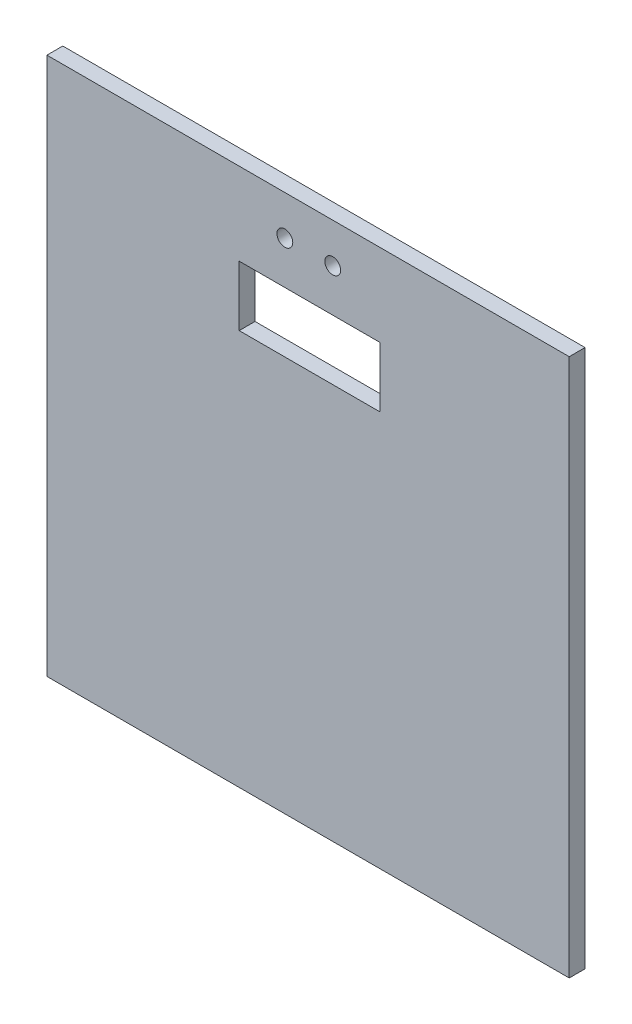
ISO-10303-21;
HEADER;
FILE_DESCRIPTION(('STEP AP214'),'2;1');
FILE_NAME('part.step','',(''),(''),'','','');
FILE_SCHEMA(('AUTOMOTIVE_DESIGN { 1 0 10303 214 1 1 1 1 }'));
ENDSEC;
DATA;
#1=APPLICATION_CONTEXT('core data for automotive mechanical design processes');
#2=APPLICATION_PROTOCOL_DEFINITION('international standard','automotive_design',2000,#1);
#3=PRODUCT_CONTEXT('',#1,'mechanical');
#4=PRODUCT('Part','Part','',(#3));
#5=PRODUCT_RELATED_PRODUCT_CATEGORY('part','',(#4));
#6=PRODUCT_DEFINITION_FORMATION('','',#4);
#7=PRODUCT_DEFINITION_CONTEXT('part definition',#1,'design');
#8=PRODUCT_DEFINITION('design','',#6,#7);
#9=PRODUCT_DEFINITION_SHAPE('','',#8);
#10=(LENGTH_UNIT() NAMED_UNIT(*) SI_UNIT(.MILLI.,.METRE.));
#11=(NAMED_UNIT(*) PLANE_ANGLE_UNIT() SI_UNIT($,.RADIAN.));
#12=(NAMED_UNIT(*) SI_UNIT($,.STERADIAN.) SOLID_ANGLE_UNIT());
#13=UNCERTAINTY_MEASURE_WITH_UNIT(LENGTH_MEASURE(1.E-05),#10,'distance_accuracy_value','');
#14=(GEOMETRIC_REPRESENTATION_CONTEXT(3) GLOBAL_UNCERTAINTY_ASSIGNED_CONTEXT((#13)) GLOBAL_UNIT_ASSIGNED_CONTEXT((#10,
#11,#12)) REPRESENTATION_CONTEXT('',''));
#15=CARTESIAN_POINT('',(0.,0.,0.));
#16=DIRECTION('',(0.,0.,1.));
#17=DIRECTION('',(1.,0.,0.));
#18=AXIS2_PLACEMENT_3D('',#15,#16,#17);
#19=CARTESIAN_POINT('',(0.,0.,32.));
#20=DIRECTION('',(0.,0.,1.));
#21=DIRECTION('',(1.,0.,0.));
#22=AXIS2_PLACEMENT_3D('',#19,#20,#21);
#23=PLANE('',#22);
#24=CARTESIAN_POINT('',(249.003592831073,330.031505481251,32.));
#25=DIRECTION('',(0.,0.,1.));
#26=DIRECTION('',(1.,0.,0.));
#27=AXIS2_PLACEMENT_3D('',#24,#25,#26);
#28=CIRCLE('',#27,0.999999999999998);
#29=CARTESIAN_POINT('',(250.003592831073,330.031505481251,32.));
#30=VERTEX_POINT('',#29);
#31=EDGE_CURVE('E161',#30,#30,#28,.T.);
#32=ORIENTED_EDGE('',*,*,#31,.F.);
#33=EDGE_LOOP('',(#32));
#34=FACE_BOUND('',#33,.T.);
#35=DIRECTION('',(0.,-1.,0.));
#36=VECTOR('',#35,1.);
#37=CARTESIAN_POINT('',(218.940861289367,335.024014524093,32.));
#38=LINE('',#37,#36);
#39=CARTESIAN_POINT('',(218.940861289367,335.024014524093,32.));
#40=VERTEX_POINT('',#39);
#41=CARTESIAN_POINT('',(218.940861289367,267.024014524093,32.));
#42=VERTEX_POINT('',#41);
#43=EDGE_CURVE('E169',#40,#42,#38,.T.);
#44=ORIENTED_EDGE('',*,*,#43,.T.);
#45=DIRECTION('',(1.,0.,0.));
#46=VECTOR('',#45,1.);
#47=CARTESIAN_POINT('',(218.940861289367,267.024014524093,32.));
#48=LINE('',#47,#46);
#49=CARTESIAN_POINT('',(284.940861289367,267.024014524093,32.));
#50=VERTEX_POINT('',#49);
#51=EDGE_CURVE('E173',#42,#50,#48,.T.);
#52=ORIENTED_EDGE('',*,*,#51,.T.);
#53=DIRECTION('',(0.,1.,0.));
#54=VECTOR('',#53,1.);
#55=CARTESIAN_POINT('',(284.940861289367,335.024014524093,32.));
#56=LINE('',#55,#54);
#57=CARTESIAN_POINT('',(284.940861289367,335.024014524093,32.));
#58=VERTEX_POINT('',#57);
#59=EDGE_CURVE('E177',#50,#58,#56,.T.);
#60=ORIENTED_EDGE('',*,*,#59,.T.);
#61=DIRECTION('',(-1.,0.,0.));
#62=VECTOR('',#61,1.);
#63=CARTESIAN_POINT('',(218.940861289367,335.024014524093,32.));
#64=LINE('',#63,#62);
#65=EDGE_CURVE('E180',#58,#40,#64,.T.);
#66=ORIENTED_EDGE('',*,*,#65,.T.);
#67=EDGE_LOOP('',(#44,#52,#60,#66));
#68=FACE_BOUND('',#67,.T.);
#69=CARTESIAN_POINT('',(255.05528253112,330.031505481251,32.));
#70=DIRECTION('',(0.,0.,1.));
#71=DIRECTION('',(1.,0.,0.));
#72=AXIS2_PLACEMENT_3D('',#69,#70,#71);
#73=CIRCLE('',#72,0.999999999999998);
#74=CARTESIAN_POINT('',(256.05528253112,330.031505481251,32.));
#75=VERTEX_POINT('',#74);
#76=EDGE_CURVE('E153',#75,#75,#73,.T.);
#77=ORIENTED_EDGE('',*,*,#76,.F.);
#78=EDGE_LOOP('',(#77));
#79=FACE_BOUND('',#78,.T.);
#80=DIRECTION('',(1.,0.,0.));
#81=VECTOR('',#80,1.);
#82=CARTESIAN_POINT('',(243.235035756278,317.023888470709,32.));
#83=LINE('',#82,#81);
#84=CARTESIAN_POINT('',(243.235035756278,317.023888470709,32.));
#85=VERTEX_POINT('',#84);
#86=CARTESIAN_POINT('',(261.035035756278,317.023888470709,32.));
#87=VERTEX_POINT('',#86);
#88=EDGE_CURVE('E114',#85,#87,#83,.T.);
#89=ORIENTED_EDGE('',*,*,#88,.F.);
#90=DIRECTION('',(0.,-1.,0.));
#91=VECTOR('',#90,1.);
#92=CARTESIAN_POINT('',(243.235035756278,324.623888470709,32.));
#93=LINE('',#92,#91);
#94=CARTESIAN_POINT('',(243.235035756278,324.623888470709,32.));
#95=VERTEX_POINT('',#94);
#96=EDGE_CURVE('E105',#95,#85,#93,.T.);
#97=ORIENTED_EDGE('',*,*,#96,.F.);
#98=DIRECTION('',(-1.,0.,0.));
#99=VECTOR('',#98,1.);
#100=CARTESIAN_POINT('',(243.235035756278,324.623888470709,32.));
#101=LINE('',#100,#99);
#102=CARTESIAN_POINT('',(261.035035756278,324.623888470709,32.));
#103=VERTEX_POINT('',#102);
#104=EDGE_CURVE('E131',#103,#95,#101,.T.);
#105=ORIENTED_EDGE('',*,*,#104,.F.);
#106=DIRECTION('',(0.,1.,0.));
#107=VECTOR('',#106,1.);
#108=CARTESIAN_POINT('',(261.035035756278,324.623888470709,32.));
#109=LINE('',#108,#107);
#110=EDGE_CURVE('E127',#87,#103,#109,.T.);
#111=ORIENTED_EDGE('',*,*,#110,.F.);
#112=EDGE_LOOP('',(#89,#97,#105,#111));
#113=FACE_BOUND('',#112,.T.);
#114=ADVANCED_FACE('F39',(#34,#68,#79,#113),#23,.T.);
#115=CARTESIAN_POINT('',(0.,0.,30.));
#116=DIRECTION('',(0.,0.,1.));
#117=DIRECTION('',(1.,0.,0.));
#118=AXIS2_PLACEMENT_3D('',#115,#116,#117);
#119=PLANE('',#118);
#120=CARTESIAN_POINT('',(255.05528253112,330.031505481251,30.));
#121=DIRECTION('',(0.,0.,1.));
#122=DIRECTION('',(1.,0.,0.));
#123=AXIS2_PLACEMENT_3D('',#120,#121,#122);
#124=CIRCLE('',#123,0.999999999999998);
#125=CARTESIAN_POINT('',(256.05528253112,330.031505481251,30.));
#126=VERTEX_POINT('',#125);
#127=EDGE_CURVE('E123',#126,#126,#124,.T.);
#128=ORIENTED_EDGE('',*,*,#127,.T.);
#129=EDGE_LOOP('',(#128));
#130=FACE_BOUND('',#129,.T.);
#131=CARTESIAN_POINT('',(249.003592831073,330.031505481251,30.));
#132=DIRECTION('',(0.,0.,1.));
#133=DIRECTION('',(1.,0.,0.));
#134=AXIS2_PLACEMENT_3D('',#131,#132,#133);
#135=CIRCLE('',#134,0.999999999999998);
#136=CARTESIAN_POINT('',(250.003592831073,330.031505481251,30.));
#137=VERTEX_POINT('',#136);
#138=EDGE_CURVE('E157',#137,#137,#135,.T.);
#139=ORIENTED_EDGE('',*,*,#138,.T.);
#140=EDGE_LOOP('',(#139));
#141=FACE_BOUND('',#140,.T.);
#142=DIRECTION('',(0.,-1.,0.));
#143=VECTOR('',#142,1.);
#144=CARTESIAN_POINT('',(218.940861289367,335.024014524093,30.));
#145=LINE('',#144,#143);
#146=CARTESIAN_POINT('',(218.940861289367,335.024014524093,30.));
#147=VERTEX_POINT('',#146);
#148=CARTESIAN_POINT('',(218.940861289367,267.024014524093,30.));
#149=VERTEX_POINT('',#148);
#150=EDGE_CURVE('E165',#147,#149,#145,.T.);
#151=ORIENTED_EDGE('',*,*,#150,.F.);
#152=DIRECTION('',(-1.,0.,0.));
#153=VECTOR('',#152,1.);
#154=CARTESIAN_POINT('',(218.940861289367,335.024014524093,30.));
#155=LINE('',#154,#153);
#156=CARTESIAN_POINT('',(284.940861289367,335.024014524093,30.));
#157=VERTEX_POINT('',#156);
#158=EDGE_CURVE('E174',#157,#147,#155,.T.);
#159=ORIENTED_EDGE('',*,*,#158,.F.);
#160=DIRECTION('',(0.,1.,0.));
#161=VECTOR('',#160,1.);
#162=CARTESIAN_POINT('',(284.940861289367,335.024014524093,30.));
#163=LINE('',#162,#161);
#164=CARTESIAN_POINT('',(284.940861289367,267.024014524093,30.));
#165=VERTEX_POINT('',#164);
#166=EDGE_CURVE('E190',#165,#157,#163,.T.);
#167=ORIENTED_EDGE('',*,*,#166,.F.);
#168=DIRECTION('',(1.,0.,0.));
#169=VECTOR('',#168,1.);
#170=CARTESIAN_POINT('',(218.940861289367,267.024014524093,30.));
#171=LINE('',#170,#169);
#172=EDGE_CURVE('E187',#149,#165,#171,.T.);
#173=ORIENTED_EDGE('',*,*,#172,.F.);
#174=EDGE_LOOP('',(#151,#159,#167,#173));
#175=FACE_BOUND('',#174,.T.);
#176=DIRECTION('',(0.,-1.,0.));
#177=VECTOR('',#176,1.);
#178=CARTESIAN_POINT('',(243.235035756278,324.623888470709,30.));
#179=LINE('',#178,#177);
#180=CARTESIAN_POINT('',(243.235035756278,324.623888470709,30.));
#181=VERTEX_POINT('',#180);
#182=CARTESIAN_POINT('',(243.235035756278,317.023888470709,30.));
#183=VERTEX_POINT('',#182);
#184=EDGE_CURVE('E63',#181,#183,#179,.T.);
#185=ORIENTED_EDGE('',*,*,#184,.T.);
#186=DIRECTION('',(1.,0.,0.));
#187=VECTOR('',#186,1.);
#188=CARTESIAN_POINT('',(243.235035756278,317.023888470709,30.));
#189=LINE('',#188,#187);
#190=CARTESIAN_POINT('',(261.035035756278,317.023888470709,30.));
#191=VERTEX_POINT('',#190);
#192=EDGE_CURVE('E121',#183,#191,#189,.T.);
#193=ORIENTED_EDGE('',*,*,#192,.T.);
#194=DIRECTION('',(0.,1.,0.));
#195=VECTOR('',#194,1.);
#196=CARTESIAN_POINT('',(261.035035756278,324.623888470709,30.));
#197=LINE('',#196,#195);
#198=CARTESIAN_POINT('',(261.035035756278,324.623888470709,30.));
#199=VERTEX_POINT('',#198);
#200=EDGE_CURVE('E140',#191,#199,#197,.T.);
#201=ORIENTED_EDGE('',*,*,#200,.T.);
#202=DIRECTION('',(-1.,0.,0.));
#203=VECTOR('',#202,1.);
#204=CARTESIAN_POINT('',(243.235035756278,324.623888470709,30.));
#205=LINE('',#204,#203);
#206=EDGE_CURVE('E115',#199,#181,#205,.T.);
#207=ORIENTED_EDGE('',*,*,#206,.T.);
#208=EDGE_LOOP('',(#185,#193,#201,#207));
#209=FACE_BOUND('',#208,.T.);
#210=ADVANCED_FACE('F213',(#130,#141,#175,#209),#119,.F.);
#211=CARTESIAN_POINT('',(218.940861289367,335.024014524093,32.));
#212=DIRECTION('',(1.,0.,0.));
#213=DIRECTION('',(0.,0.,-1.));
#214=AXIS2_PLACEMENT_3D('',#211,#212,#213);
#215=PLANE('',#214);
#216=ORIENTED_EDGE('',*,*,#150,.T.);
#217=DIRECTION('',(0.,0.,-1.));
#218=VECTOR('',#217,1.);
#219=CARTESIAN_POINT('',(218.940861289367,267.024014524093,32.));
#220=LINE('',#219,#218);
#221=EDGE_CURVE('E11',#42,#149,#220,.T.);
#222=ORIENTED_EDGE('',*,*,#221,.F.);
#223=ORIENTED_EDGE('',*,*,#43,.F.);
#224=DIRECTION('',(0.,0.,-1.));
#225=VECTOR('',#224,1.);
#226=CARTESIAN_POINT('',(218.940861289367,335.024014524093,32.));
#227=LINE('',#226,#225);
#228=EDGE_CURVE('E183',#40,#147,#227,.T.);
#229=ORIENTED_EDGE('',*,*,#228,.T.);
#230=EDGE_LOOP('',(#216,#222,#223,#229));
#231=FACE_BOUND('',#230,.T.);
#232=ADVANCED_FACE('F41',(#231),#215,.F.);
#233=CARTESIAN_POINT('',(218.940861289367,267.024014524093,32.));
#234=DIRECTION('',(0.,1.,0.));
#235=DIRECTION('',(0.,0.,1.));
#236=AXIS2_PLACEMENT_3D('',#233,#234,#235);
#237=PLANE('',#236);
#238=ORIENTED_EDGE('',*,*,#172,.T.);
#239=DIRECTION('',(0.,0.,-1.));
#240=VECTOR('',#239,1.);
#241=CARTESIAN_POINT('',(284.940861289367,267.024014524093,32.));
#242=LINE('',#241,#240);
#243=EDGE_CURVE('E48',#50,#165,#242,.T.);
#244=ORIENTED_EDGE('',*,*,#243,.F.);
#245=ORIENTED_EDGE('',*,*,#51,.F.);
#246=ORIENTED_EDGE('',*,*,#221,.T.);
#247=EDGE_LOOP('',(#238,#244,#245,#246));
#248=FACE_BOUND('',#247,.T.);
#249=ADVANCED_FACE('F224',(#248),#237,.F.);
#250=CARTESIAN_POINT('',(284.940861289367,335.024014524093,32.));
#251=DIRECTION('',(-1.,0.,0.));
#252=DIRECTION('',(0.,-1.,0.));
#253=AXIS2_PLACEMENT_3D('',#250,#251,#252);
#254=PLANE('',#253);
#255=ORIENTED_EDGE('',*,*,#166,.T.);
#256=DIRECTION('',(0.,0.,-1.));
#257=VECTOR('',#256,1.);
#258=CARTESIAN_POINT('',(284.940861289367,335.024014524093,32.));
#259=LINE('',#258,#257);
#260=EDGE_CURVE('E198',#58,#157,#259,.T.);
#261=ORIENTED_EDGE('',*,*,#260,.F.);
#262=ORIENTED_EDGE('',*,*,#59,.F.);
#263=ORIENTED_EDGE('',*,*,#243,.T.);
#264=EDGE_LOOP('',(#255,#261,#262,#263));
#265=FACE_BOUND('',#264,.T.);
#266=ADVANCED_FACE('F207',(#265),#254,.F.);
#267=CARTESIAN_POINT('',(218.940861289367,335.024014524093,32.));
#268=DIRECTION('',(0.,-1.,0.));
#269=DIRECTION('',(1.,0.,0.));
#270=AXIS2_PLACEMENT_3D('',#267,#268,#269);
#271=PLANE('',#270);
#272=ORIENTED_EDGE('',*,*,#158,.T.);
#273=ORIENTED_EDGE('',*,*,#228,.F.);
#274=ORIENTED_EDGE('',*,*,#65,.F.);
#275=ORIENTED_EDGE('',*,*,#260,.T.);
#276=EDGE_LOOP('',(#272,#273,#274,#275));
#277=FACE_BOUND('',#276,.T.);
#278=ADVANCED_FACE('F217',(#277),#271,.F.);
#279=CARTESIAN_POINT('',(249.003592831073,330.031505481251,32.));
#280=DIRECTION('',(0.,0.,-1.));
#281=DIRECTION('',(-1.,0.,0.));
#282=AXIS2_PLACEMENT_3D('',#279,#280,#281);
#283=CYLINDRICAL_SURFACE('',#282,0.999999999999998);
#284=ORIENTED_EDGE('',*,*,#31,.T.);
#285=EDGE_LOOP('',(#284));
#286=FACE_BOUND('',#285,.T.);
#287=ORIENTED_EDGE('',*,*,#138,.F.);
#288=EDGE_LOOP('',(#287));
#289=FACE_BOUND('',#288,.T.);
#290=ADVANCED_FACE('F241',(#286,#289),#283,.F.);
#291=CARTESIAN_POINT('',(255.05528253112,330.031505481251,32.));
#292=DIRECTION('',(0.,0.,-1.));
#293=DIRECTION('',(-1.,0.,0.));
#294=AXIS2_PLACEMENT_3D('',#291,#292,#293);
#295=CYLINDRICAL_SURFACE('',#294,0.999999999999998);
#296=ORIENTED_EDGE('',*,*,#76,.T.);
#297=EDGE_LOOP('',(#296));
#298=FACE_BOUND('',#297,.T.);
#299=ORIENTED_EDGE('',*,*,#127,.F.);
#300=EDGE_LOOP('',(#299));
#301=FACE_BOUND('',#300,.T.);
#302=ADVANCED_FACE('F248',(#298,#301),#295,.F.);
#303=CARTESIAN_POINT('',(243.235035756278,324.623888470709,32.));
#304=DIRECTION('',(1.,0.,0.));
#305=DIRECTION('',(0.,1.,0.));
#306=AXIS2_PLACEMENT_3D('',#303,#304,#305);
#307=PLANE('',#306);
#308=ORIENTED_EDGE('',*,*,#184,.F.);
#309=DIRECTION('',(0.,0.,-1.));
#310=VECTOR('',#309,1.);
#311=CARTESIAN_POINT('',(243.235035756278,324.623888470709,32.));
#312=LINE('',#311,#310);
#313=EDGE_CURVE('E109',#95,#181,#312,.T.);
#314=ORIENTED_EDGE('',*,*,#313,.F.);
#315=ORIENTED_EDGE('',*,*,#96,.T.);
#316=DIRECTION('',(0.,0.,-1.));
#317=VECTOR('',#316,1.);
#318=CARTESIAN_POINT('',(243.235035756278,317.023888470709,32.));
#319=LINE('',#318,#317);
#320=EDGE_CURVE('E108',#85,#183,#319,.T.);
#321=ORIENTED_EDGE('',*,*,#320,.T.);
#322=EDGE_LOOP('',(#308,#314,#315,#321));
#323=FACE_BOUND('',#322,.T.);
#324=ADVANCED_FACE('F107',(#323),#307,.T.);
#325=CARTESIAN_POINT('',(243.235035756278,317.023888470709,32.));
#326=DIRECTION('',(0.,1.,0.));
#327=DIRECTION('',(0.,0.,1.));
#328=AXIS2_PLACEMENT_3D('',#325,#326,#327);
#329=PLANE('',#328);
#330=ORIENTED_EDGE('',*,*,#192,.F.);
#331=ORIENTED_EDGE('',*,*,#320,.F.);
#332=ORIENTED_EDGE('',*,*,#88,.T.);
#333=DIRECTION('',(0.,0.,-1.));
#334=VECTOR('',#333,1.);
#335=CARTESIAN_POINT('',(261.035035756278,317.023888470709,32.));
#336=LINE('',#335,#334);
#337=EDGE_CURVE('E124',#87,#191,#336,.T.);
#338=ORIENTED_EDGE('',*,*,#337,.T.);
#339=EDGE_LOOP('',(#330,#331,#332,#338));
#340=FACE_BOUND('',#339,.T.);
#341=ADVANCED_FACE('F118',(#340),#329,.T.);
#342=CARTESIAN_POINT('',(261.035035756278,324.623888470709,32.));
#343=DIRECTION('',(-1.,0.,0.));
#344=DIRECTION('',(0.,0.,1.));
#345=AXIS2_PLACEMENT_3D('',#342,#343,#344);
#346=PLANE('',#345);
#347=ORIENTED_EDGE('',*,*,#200,.F.);
#348=ORIENTED_EDGE('',*,*,#337,.F.);
#349=ORIENTED_EDGE('',*,*,#110,.T.);
#350=DIRECTION('',(0.,0.,-1.));
#351=VECTOR('',#350,1.);
#352=CARTESIAN_POINT('',(261.035035756278,324.623888470709,32.));
#353=LINE('',#352,#351);
#354=EDGE_CURVE('E55',#103,#199,#353,.T.);
#355=ORIENTED_EDGE('',*,*,#354,.T.);
#356=EDGE_LOOP('',(#347,#348,#349,#355));
#357=FACE_BOUND('',#356,.T.);
#358=ADVANCED_FACE('F265',(#357),#346,.T.);
#359=CARTESIAN_POINT('',(243.235035756278,324.623888470709,32.));
#360=DIRECTION('',(0.,-1.,0.));
#361=DIRECTION('',(0.,0.,-1.));
#362=AXIS2_PLACEMENT_3D('',#359,#360,#361);
#363=PLANE('',#362);
#364=ORIENTED_EDGE('',*,*,#206,.F.);
#365=ORIENTED_EDGE('',*,*,#354,.F.);
#366=ORIENTED_EDGE('',*,*,#104,.T.);
#367=ORIENTED_EDGE('',*,*,#313,.T.);
#368=EDGE_LOOP('',(#364,#365,#366,#367));
#369=FACE_BOUND('',#368,.T.);
#370=ADVANCED_FACE('F268',(#369),#363,.T.);
#371=CLOSED_SHELL('',(#114,#210,#232,#249,#266,#278,#290,#302,#324,#341,#358,#370));
#372=MANIFOLD_SOLID_BREP('B2',#371);
#373=ADVANCED_BREP_SHAPE_REPRESENTATION('',(#18,#372),#14);
#374=SHAPE_DEFINITION_REPRESENTATION(#9,#373);
ENDSEC;
END-ISO-10303-21;
